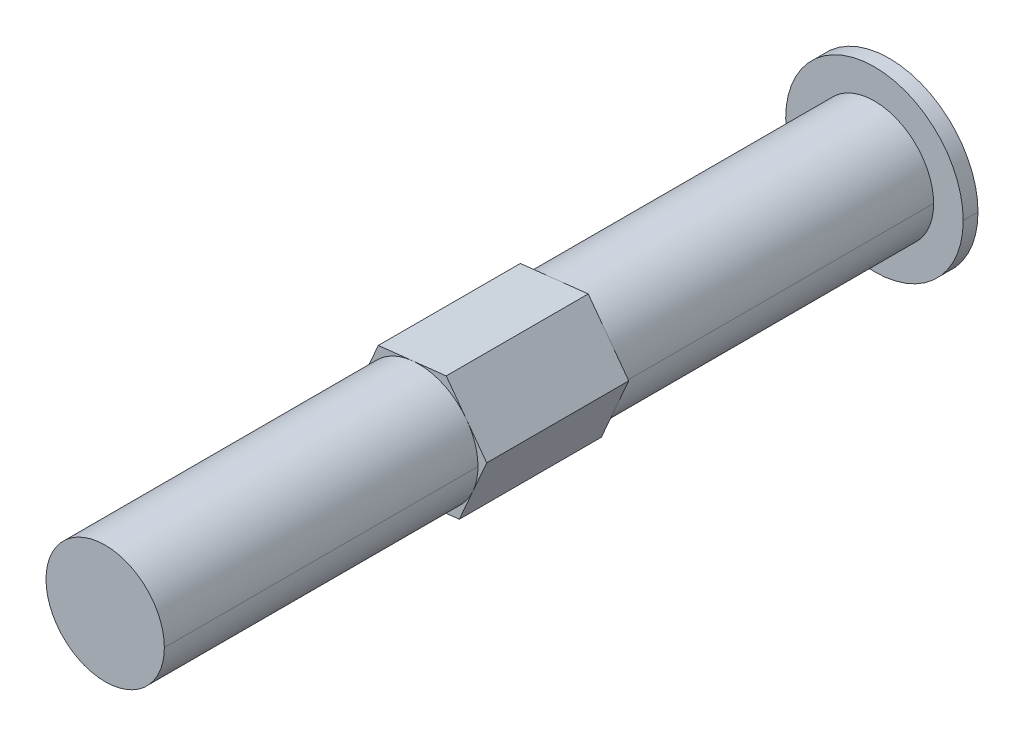
ISO-10303-21;
HEADER;
FILE_DESCRIPTION(('STEP AP214'),'2;1');
FILE_NAME('part.step','',(''),(''),'','','');
FILE_SCHEMA(('AUTOMOTIVE_DESIGN { 1 0 10303 214 1 1 1 1 }'));
ENDSEC;
DATA;
#1=APPLICATION_CONTEXT('core data for automotive mechanical design processes');
#2=APPLICATION_PROTOCOL_DEFINITION('international standard','automotive_design',2000,#1);
#3=PRODUCT_CONTEXT('',#1,'mechanical');
#4=PRODUCT('Part','Part','',(#3));
#5=PRODUCT_RELATED_PRODUCT_CATEGORY('part','',(#4));
#6=PRODUCT_DEFINITION_FORMATION('','',#4);
#7=PRODUCT_DEFINITION_CONTEXT('part definition',#1,'design');
#8=PRODUCT_DEFINITION('design','',#6,#7);
#9=PRODUCT_DEFINITION_SHAPE('','',#8);
#10=(LENGTH_UNIT() NAMED_UNIT(*) SI_UNIT(.MILLI.,.METRE.));
#11=(NAMED_UNIT(*) PLANE_ANGLE_UNIT() SI_UNIT($,.RADIAN.));
#12=(NAMED_UNIT(*) SI_UNIT($,.STERADIAN.) SOLID_ANGLE_UNIT());
#13=UNCERTAINTY_MEASURE_WITH_UNIT(LENGTH_MEASURE(1.E-05),#10,'distance_accuracy_value','');
#14=(GEOMETRIC_REPRESENTATION_CONTEXT(3) GLOBAL_UNCERTAINTY_ASSIGNED_CONTEXT((#13)) GLOBAL_UNIT_ASSIGNED_CONTEXT((#10,
#11,#12)) REPRESENTATION_CONTEXT('',''));
#15=CARTESIAN_POINT('',(0.,0.,0.));
#16=DIRECTION('',(0.,0.,1.));
#17=DIRECTION('',(1.,0.,0.));
#18=AXIS2_PLACEMENT_3D('',#15,#16,#17);
#19=CARTESIAN_POINT('',(0.,0.,-10.31875));
#20=DIRECTION('',(0.,0.,-1.));
#21=DIRECTION('',(0.,-1.,0.));
#22=AXIS2_PLACEMENT_3D('',#19,#20,#21);
#23=PLANE('',#22);
#24=CARTESIAN_POINT('',(0.,0.,-10.31875));
#25=DIRECTION('',(0.,0.,1.));
#26=DIRECTION('',(-1.,0.,0.));
#27=AXIS2_PLACEMENT_3D('',#24,#25,#26);
#28=CIRCLE('',#27,1.5875);
#29=CARTESIAN_POINT('',(1.5875,0.,-10.31875));
#30=VERTEX_POINT('',#29);
#31=CARTESIAN_POINT('',(-1.5875,0.,-10.31875));
#32=VERTEX_POINT('',#31);
#33=EDGE_CURVE('E172',#30,#32,#28,.T.);
#34=ORIENTED_EDGE('',*,*,#33,.F.);
#35=CARTESIAN_POINT('',(0.,0.,-10.31875));
#36=DIRECTION('',(0.,0.,1.));
#37=DIRECTION('',(-1.,0.,0.));
#38=AXIS2_PLACEMENT_3D('',#35,#36,#37);
#39=CIRCLE('',#38,1.5875);
#40=EDGE_CURVE('E165',#32,#30,#39,.T.);
#41=ORIENTED_EDGE('',*,*,#40,.F.);
#42=EDGE_LOOP('',(#34,#41));
#43=FACE_BOUND('',#42,.T.);
#44=CARTESIAN_POINT('',(0.,0.,-10.31875));
#45=DIRECTION('',(0.,0.,-1.));
#46=DIRECTION('',(-1.,0.,0.));
#47=AXIS2_PLACEMENT_3D('',#44,#45,#46);
#48=CIRCLE('',#47,2.38125);
#49=CARTESIAN_POINT('',(2.38125,0.,-10.31875));
#50=VERTEX_POINT('',#49);
#51=CARTESIAN_POINT('',(-2.38125,0.,-10.31875));
#52=VERTEX_POINT('',#51);
#53=EDGE_CURVE('E11',#50,#52,#48,.T.);
#54=ORIENTED_EDGE('',*,*,#53,.F.);
#55=CARTESIAN_POINT('',(0.,0.,-10.31875));
#56=DIRECTION('',(0.,0.,-1.));
#57=DIRECTION('',(-1.,0.,0.));
#58=AXIS2_PLACEMENT_3D('',#55,#56,#57);
#59=CIRCLE('',#58,2.38125);
#60=EDGE_CURVE('E170',#52,#50,#59,.T.);
#61=ORIENTED_EDGE('',*,*,#60,.F.);
#62=EDGE_LOOP('',(#54,#61));
#63=FACE_BOUND('',#62,.T.);
#64=ADVANCED_FACE('F16',(#43,#63),#23,.F.);
#65=CARTESIAN_POINT('',(0.,0.,-10.715625));
#66=DIRECTION('',(0.,0.,-1.));
#67=DIRECTION('',(0.,-1.,0.));
#68=AXIS2_PLACEMENT_3D('',#65,#66,#67);
#69=PLANE('',#68);
#70=CARTESIAN_POINT('',(0.,0.,-10.715625));
#71=DIRECTION('',(0.,0.,-1.));
#72=DIRECTION('',(-1.,0.,0.));
#73=AXIS2_PLACEMENT_3D('',#70,#71,#72);
#74=CIRCLE('',#73,2.38125);
#75=CARTESIAN_POINT('',(2.38125,0.,-10.715625));
#76=VERTEX_POINT('',#75);
#77=CARTESIAN_POINT('',(-2.38125,0.,-10.715625));
#78=VERTEX_POINT('',#77);
#79=EDGE_CURVE('E27',#76,#78,#74,.T.);
#80=ORIENTED_EDGE('',*,*,#79,.T.);
#81=CARTESIAN_POINT('',(0.,0.,-10.715625));
#82=DIRECTION('',(0.,0.,-1.));
#83=DIRECTION('',(-1.,0.,0.));
#84=AXIS2_PLACEMENT_3D('',#81,#82,#83);
#85=CIRCLE('',#84,2.38125);
#86=EDGE_CURVE('E168',#78,#76,#85,.T.);
#87=ORIENTED_EDGE('',*,*,#86,.T.);
#88=EDGE_LOOP('',(#80,#87));
#89=FACE_BOUND('',#88,.T.);
#90=ADVANCED_FACE('F174',(#89),#69,.T.);
#91=CARTESIAN_POINT('',(0.,0.,-10.715625));
#92=DIRECTION('',(0.,0.,1.));
#93=DIRECTION('',(1.,0.,0.));
#94=AXIS2_PLACEMENT_3D('',#91,#92,#93);
#95=CYLINDRICAL_SURFACE('',#94,2.38125);
#96=DIRECTION('',(0.,0.,1.));
#97=VECTOR('',#96,1.);
#98=CARTESIAN_POINT('',(-2.38125,0.,-10.715625));
#99=LINE('',#98,#97);
#100=EDGE_CURVE('E160',#78,#52,#99,.T.);
#101=ORIENTED_EDGE('',*,*,#100,.F.);
#102=ORIENTED_EDGE('',*,*,#79,.F.);
#103=DIRECTION('',(0.,0.,1.));
#104=VECTOR('',#103,1.);
#105=CARTESIAN_POINT('',(2.38125,0.,-10.715625));
#106=LINE('',#105,#104);
#107=EDGE_CURVE('E157',#76,#50,#106,.T.);
#108=ORIENTED_EDGE('',*,*,#107,.T.);
#109=ORIENTED_EDGE('',*,*,#53,.T.);
#110=EDGE_LOOP('',(#101,#102,#108,#109));
#111=FACE_BOUND('',#110,.T.);
#112=ADVANCED_FACE('F156',(#111),#95,.T.);
#113=CARTESIAN_POINT('',(0.,0.,-10.31875));
#114=DIRECTION('',(0.,0.,1.));
#115=DIRECTION('',(1.,0.,0.));
#116=AXIS2_PLACEMENT_3D('',#113,#114,#115);
#117=CYLINDRICAL_SURFACE('',#116,1.5875);
#118=DIRECTION('',(0.,0.,1.));
#119=VECTOR('',#118,1.);
#120=CARTESIAN_POINT('',(-1.5875,0.,-10.31875));
#121=LINE('',#120,#119);
#122=CARTESIAN_POINT('',(-1.5875,0.,-1.905));
#123=VERTEX_POINT('',#122);
#124=EDGE_CURVE('E211',#32,#123,#121,.T.);
#125=ORIENTED_EDGE('',*,*,#124,.F.);
#126=ORIENTED_EDGE('',*,*,#40,.T.);
#127=DIRECTION('',(0.,0.,1.));
#128=VECTOR('',#127,1.);
#129=CARTESIAN_POINT('',(1.5875,0.,-10.31875));
#130=LINE('',#129,#128);
#131=CARTESIAN_POINT('',(1.5875,0.,-1.905));
#132=VERTEX_POINT('',#131);
#133=EDGE_CURVE('E195',#30,#132,#130,.T.);
#134=ORIENTED_EDGE('',*,*,#133,.T.);
#135=CARTESIAN_POINT('',(0.,0.,-1.905));
#136=DIRECTION('',(0.,0.,-1.));
#137=DIRECTION('',(1.,0.,0.));
#138=AXIS2_PLACEMENT_3D('',#135,#136,#137);
#139=CIRCLE('',#138,1.5875);
#140=CARTESIAN_POINT('',(1.45421930245627,-0.636712235129486,-1.905));
#141=VERTEX_POINT('',#140);
#142=EDGE_CURVE('E42',#132,#141,#139,.T.);
#143=ORIENTED_EDGE('',*,*,#142,.T.);
#144=CARTESIAN_POINT('',(0.,0.,-1.905));
#145=DIRECTION('',(0.,0.,-1.));
#146=DIRECTION('',(1.,0.,0.));
#147=AXIS2_PLACEMENT_3D('',#144,#145,#146);
#148=CIRCLE('',#147,1.5875);
#149=CARTESIAN_POINT('',(0.175700680705631,-1.57774697616557,-1.905));
#150=VERTEX_POINT('',#149);
#151=EDGE_CURVE('E314',#141,#150,#148,.T.);
#152=ORIENTED_EDGE('',*,*,#151,.T.);
#153=CARTESIAN_POINT('',(0.,0.,-1.905));
#154=DIRECTION('',(0.,0.,-1.));
#155=DIRECTION('',(1.,0.,0.));
#156=AXIS2_PLACEMENT_3D('',#153,#154,#155);
#157=CIRCLE('',#156,1.5875);
#158=CARTESIAN_POINT('',(-1.27851862175064,-0.941034741036078,-1.905));
#159=VERTEX_POINT('',#158);
#160=EDGE_CURVE('E309',#150,#159,#157,.T.);
#161=ORIENTED_EDGE('',*,*,#160,.T.);
#162=CARTESIAN_POINT('',(0.,0.,-1.905));
#163=DIRECTION('',(0.,0.,-1.));
#164=DIRECTION('',(1.,0.,0.));
#165=AXIS2_PLACEMENT_3D('',#162,#163,#164);
#166=CIRCLE('',#165,1.5875);
#167=EDGE_CURVE('E313',#159,#123,#166,.T.);
#168=ORIENTED_EDGE('',*,*,#167,.T.);
#169=EDGE_LOOP('',(#125,#126,#134,#143,#152,#161,#168));
#170=FACE_BOUND('',#169,.T.);
#171=ADVANCED_FACE('F454',(#170),#117,.T.);
#172=CARTESIAN_POINT('',(0.,0.,-1.905));
#173=DIRECTION('',(0.,0.,1.));
#174=DIRECTION('',(1.,0.,0.));
#175=AXIS2_PLACEMENT_3D('',#172,#173,#174);
#176=PLANE('',#175);
#177=CARTESIAN_POINT('',(0.,0.,-1.905));
#178=DIRECTION('',(0.,0.,-1.));
#179=DIRECTION('',(1.,0.,0.));
#180=AXIS2_PLACEMENT_3D('',#177,#178,#179);
#181=CIRCLE('',#180,1.5875);
#182=CARTESIAN_POINT('',(1.27851862175064,0.941034741036077,-1.905));
#183=VERTEX_POINT('',#182);
#184=EDGE_CURVE('E191',#183,#132,#181,.T.);
#185=ORIENTED_EDGE('',*,*,#184,.F.);
#186=DIRECTION('',(-0.592777789629025,0.805366060945287,0.));
#187=VECTOR('',#186,1.);
#188=CARTESIAN_POINT('',(1.82182528280461,0.202881670604394,-1.905));
#189=LINE('',#188,#187);
#190=CARTESIAN_POINT('',(1.82182528280461,0.202881670604394,-1.905));
#191=VERTEX_POINT('',#190);
#192=EDGE_CURVE('E269',#191,#183,#189,.T.);
#193=ORIENTED_EDGE('',*,*,#192,.F.);
#194=DIRECTION('',(0.401078573309912,0.916043655090567,0.));
#195=VECTOR('',#194,1.);
#196=CARTESIAN_POINT('',(1.08661332210794,-1.47630614086337,-1.905));
#197=LINE('',#196,#195);
#198=EDGE_CURVE('E305',#141,#191,#197,.T.);
#199=ORIENTED_EDGE('',*,*,#198,.F.);
#200=ORIENTED_EDGE('',*,*,#142,.F.);
#201=EDGE_LOOP('',(#185,#193,#199,#200));
#202=FACE_BOUND('',#201,.T.);
#203=ADVANCED_FACE('F448',(#202),#176,.F.);
#204=CARTESIAN_POINT('',(0.,0.,1.905));
#205=DIRECTION('',(0.,0.,1.));
#206=DIRECTION('',(1.,0.,0.));
#207=AXIS2_PLACEMENT_3D('',#204,#205,#206);
#208=PLANE('',#207);
#209=DIRECTION('',(-0.592777789629025,0.805366060945287,0.));
#210=VECTOR('',#209,1.);
#211=CARTESIAN_POINT('',(1.82182528280461,0.202881670604394,1.905));
#212=LINE('',#211,#210);
#213=CARTESIAN_POINT('',(1.82182528280461,0.202881670604394,1.905));
#214=VERTEX_POINT('',#213);
#215=CARTESIAN_POINT('',(1.27851862175064,0.941034741036077,1.905));
#216=VERTEX_POINT('',#215);
#217=EDGE_CURVE('E284',#214,#216,#212,.T.);
#218=ORIENTED_EDGE('',*,*,#217,.T.);
#219=CARTESIAN_POINT('',(0.,0.,1.905));
#220=DIRECTION('',(0.,0.,-1.));
#221=DIRECTION('',(1.,0.,0.));
#222=AXIS2_PLACEMENT_3D('',#219,#220,#221);
#223=CIRCLE('',#222,1.5875);
#224=CARTESIAN_POINT('',(1.5875,0.,1.905));
#225=VERTEX_POINT('',#224);
#226=EDGE_CURVE('E250',#216,#225,#223,.T.);
#227=ORIENTED_EDGE('',*,*,#226,.T.);
#228=CARTESIAN_POINT('',(0.,0.,1.905));
#229=DIRECTION('',(0.,0.,-1.));
#230=DIRECTION('',(1.,0.,0.));
#231=AXIS2_PLACEMENT_3D('',#228,#229,#230);
#232=CIRCLE('',#231,1.5875);
#233=CARTESIAN_POINT('',(1.45421930245627,-0.636712235129486,1.905));
#234=VERTEX_POINT('',#233);
#235=EDGE_CURVE('E201',#225,#234,#232,.T.);
#236=ORIENTED_EDGE('',*,*,#235,.T.);
#237=DIRECTION('',(0.401078573309912,0.916043655090567,0.));
#238=VECTOR('',#237,1.);
#239=CARTESIAN_POINT('',(1.08661332210794,-1.47630614086337,1.905));
#240=LINE('',#239,#238);
#241=EDGE_CURVE('E280',#234,#214,#240,.T.);
#242=ORIENTED_EDGE('',*,*,#241,.T.);
#243=EDGE_LOOP('',(#218,#227,#236,#242));
#244=FACE_BOUND('',#243,.T.);
#245=ADVANCED_FACE('F435',(#244),#208,.T.);
#246=CARTESIAN_POINT('',(0.,0.,-1.905));
#247=DIRECTION('',(0.,0.,1.));
#248=DIRECTION('',(1.,0.,0.));
#249=AXIS2_PLACEMENT_3D('',#246,#247,#248);
#250=PLANE('',#249);
#251=CARTESIAN_POINT('',(0.,0.,-1.905));
#252=DIRECTION('',(0.,0.,-1.));
#253=DIRECTION('',(1.,0.,0.));
#254=AXIS2_PLACEMENT_3D('',#251,#252,#253);
#255=CIRCLE('',#254,1.5875);
#256=CARTESIAN_POINT('',(-0.175700680705631,1.57774697616557,-1.905));
#257=VERTEX_POINT('',#256);
#258=EDGE_CURVE('E196',#257,#183,#255,.T.);
#259=ORIENTED_EDGE('',*,*,#258,.F.);
#260=DIRECTION('',(-0.993856362938937,-0.11067759414528,0.));
#261=VECTOR('',#260,1.);
#262=CARTESIAN_POINT('',(0.735211960696675,1.67918781146776,-1.905));
#263=LINE('',#262,#261);
#264=CARTESIAN_POINT('',(0.735211960696675,1.67918781146776,-1.905));
#265=VERTEX_POINT('',#264);
#266=EDGE_CURVE('E216',#265,#257,#263,.T.);
#267=ORIENTED_EDGE('',*,*,#266,.F.);
#268=DIRECTION('',(-0.592777789629025,0.805366060945287,0.));
#269=VECTOR('',#268,1.);
#270=CARTESIAN_POINT('',(1.82182528280461,0.202881670604394,-1.905));
#271=LINE('',#270,#269);
#272=EDGE_CURVE('E265',#183,#265,#271,.T.);
#273=ORIENTED_EDGE('',*,*,#272,.F.);
#274=EDGE_LOOP('',(#259,#267,#273));
#275=FACE_BOUND('',#274,.T.);
#276=ADVANCED_FACE('F443',(#275),#250,.F.);
#277=CARTESIAN_POINT('',(0.,0.,-1.905));
#278=DIRECTION('',(0.,0.,1.));
#279=DIRECTION('',(1.,0.,0.));
#280=AXIS2_PLACEMENT_3D('',#277,#278,#279);
#281=PLANE('',#280);
#282=CARTESIAN_POINT('',(0.,0.,-1.905));
#283=DIRECTION('',(0.,0.,-1.));
#284=DIRECTION('',(1.,0.,0.));
#285=AXIS2_PLACEMENT_3D('',#282,#283,#284);
#286=CIRCLE('',#285,1.5875);
#287=CARTESIAN_POINT('',(-1.45421930245627,0.636712235129486,-1.905));
#288=VERTEX_POINT('',#287);
#289=EDGE_CURVE('E249',#288,#257,#286,.T.);
#290=ORIENTED_EDGE('',*,*,#289,.F.);
#291=DIRECTION('',(-0.401078573309912,-0.916043655090567,0.));
#292=VECTOR('',#291,1.);
#293=CARTESIAN_POINT('',(-1.08661332210794,1.47630614086337,-1.905));
#294=LINE('',#293,#292);
#295=CARTESIAN_POINT('',(-1.08661332210794,1.47630614086337,-1.905));
#296=VERTEX_POINT('',#295);
#297=EDGE_CURVE('E232',#296,#288,#294,.T.);
#298=ORIENTED_EDGE('',*,*,#297,.F.);
#299=DIRECTION('',(-0.993856362938937,-0.11067759414528,0.));
#300=VECTOR('',#299,1.);
#301=CARTESIAN_POINT('',(0.735211960696675,1.67918781146776,-1.905));
#302=LINE('',#301,#300);
#303=EDGE_CURVE('E212',#257,#296,#302,.T.);
#304=ORIENTED_EDGE('',*,*,#303,.F.);
#305=EDGE_LOOP('',(#290,#298,#304));
#306=FACE_BOUND('',#305,.T.);
#307=ADVANCED_FACE('F18',(#306),#281,.F.);
#308=CARTESIAN_POINT('',(0.,0.,-1.905));
#309=DIRECTION('',(0.,0.,1.));
#310=DIRECTION('',(1.,0.,0.));
#311=AXIS2_PLACEMENT_3D('',#308,#309,#310);
#312=PLANE('',#311);
#313=ORIENTED_EDGE('',*,*,#167,.F.);
#314=DIRECTION('',(0.592777789629025,-0.805366060945287,0.));
#315=VECTOR('',#314,1.);
#316=CARTESIAN_POINT('',(-1.82182528280461,-0.202881670604394,-1.905));
#317=LINE('',#316,#315);
#318=CARTESIAN_POINT('',(-1.82182528280461,-0.202881670604394,-1.905));
#319=VERTEX_POINT('',#318);
#320=EDGE_CURVE('E223',#319,#159,#317,.T.);
#321=ORIENTED_EDGE('',*,*,#320,.F.);
#322=DIRECTION('',(-0.401078573309912,-0.916043655090567,0.));
#323=VECTOR('',#322,1.);
#324=CARTESIAN_POINT('',(-1.08661332210794,1.47630614086337,-1.905));
#325=LINE('',#324,#323);
#326=EDGE_CURVE('E295',#288,#319,#325,.T.);
#327=ORIENTED_EDGE('',*,*,#326,.F.);
#328=CARTESIAN_POINT('',(0.,0.,-1.905));
#329=DIRECTION('',(0.,0.,-1.));
#330=DIRECTION('',(1.,0.,0.));
#331=AXIS2_PLACEMENT_3D('',#328,#329,#330);
#332=CIRCLE('',#331,1.5875);
#333=EDGE_CURVE('E245',#123,#288,#332,.T.);
#334=ORIENTED_EDGE('',*,*,#333,.F.);
#335=EDGE_LOOP('',(#313,#321,#327,#334));
#336=FACE_BOUND('',#335,.T.);
#337=ADVANCED_FACE('F456',(#336),#312,.F.);
#338=CARTESIAN_POINT('',(0.,0.,-1.905));
#339=DIRECTION('',(0.,0.,1.));
#340=DIRECTION('',(1.,0.,0.));
#341=AXIS2_PLACEMENT_3D('',#338,#339,#340);
#342=PLANE('',#341);
#343=ORIENTED_EDGE('',*,*,#160,.F.);
#344=DIRECTION('',(0.993856362938937,0.11067759414528,0.));
#345=VECTOR('',#344,1.);
#346=CARTESIAN_POINT('',(-0.735211960696674,-1.67918781146776,-1.905));
#347=LINE('',#346,#345);
#348=CARTESIAN_POINT('',(-0.735211960696674,-1.67918781146776,-1.905));
#349=VERTEX_POINT('',#348);
#350=EDGE_CURVE('E189',#349,#150,#347,.T.);
#351=ORIENTED_EDGE('',*,*,#350,.F.);
#352=DIRECTION('',(0.592777789629025,-0.805366060945287,0.));
#353=VECTOR('',#352,1.);
#354=CARTESIAN_POINT('',(-1.82182528280461,-0.202881670604394,-1.905));
#355=LINE('',#354,#353);
#356=EDGE_CURVE('E218',#159,#349,#355,.T.);
#357=ORIENTED_EDGE('',*,*,#356,.F.);
#358=EDGE_LOOP('',(#343,#351,#357));
#359=FACE_BOUND('',#358,.T.);
#360=ADVANCED_FACE('F458',(#359),#342,.F.);
#361=CARTESIAN_POINT('',(0.,0.,-1.905));
#362=DIRECTION('',(0.,0.,1.));
#363=DIRECTION('',(1.,0.,0.));
#364=AXIS2_PLACEMENT_3D('',#361,#362,#363);
#365=PLANE('',#364);
#366=ORIENTED_EDGE('',*,*,#151,.F.);
#367=DIRECTION('',(0.401078573309912,0.916043655090567,0.));
#368=VECTOR('',#367,1.);
#369=CARTESIAN_POINT('',(1.08661332210794,-1.47630614086337,-1.905));
#370=LINE('',#369,#368);
#371=CARTESIAN_POINT('',(1.08661332210794,-1.47630614086337,-1.905));
#372=VERTEX_POINT('',#371);
#373=EDGE_CURVE('E279',#372,#141,#370,.T.);
#374=ORIENTED_EDGE('',*,*,#373,.F.);
#375=DIRECTION('',(0.993856362938937,0.11067759414528,0.));
#376=VECTOR('',#375,1.);
#377=CARTESIAN_POINT('',(-0.735211960696674,-1.67918781146776,-1.905));
#378=LINE('',#377,#376);
#379=EDGE_CURVE('E254',#150,#372,#378,.T.);
#380=ORIENTED_EDGE('',*,*,#379,.F.);
#381=EDGE_LOOP('',(#366,#374,#380));
#382=FACE_BOUND('',#381,.T.);
#383=ADVANCED_FACE('F465',(#382),#365,.F.);
#384=CARTESIAN_POINT('',(0.,0.,1.905));
#385=DIRECTION('',(0.,0.,1.));
#386=DIRECTION('',(1.,0.,0.));
#387=AXIS2_PLACEMENT_3D('',#384,#385,#386);
#388=PLANE('',#387);
#389=DIRECTION('',(-0.993856362938937,-0.11067759414528,0.));
#390=VECTOR('',#389,1.);
#391=CARTESIAN_POINT('',(0.735211960696675,1.67918781146776,1.905));
#392=LINE('',#391,#390);
#393=CARTESIAN_POINT('',(0.735211960696675,1.67918781146776,1.905));
#394=VERTEX_POINT('',#393);
#395=CARTESIAN_POINT('',(-0.175700680705631,1.57774697616557,1.905));
#396=VERTEX_POINT('',#395);
#397=EDGE_CURVE('E263',#394,#396,#392,.T.);
#398=ORIENTED_EDGE('',*,*,#397,.T.);
#399=CARTESIAN_POINT('',(0.,0.,1.905));
#400=DIRECTION('',(0.,0.,-1.));
#401=DIRECTION('',(1.,0.,0.));
#402=AXIS2_PLACEMENT_3D('',#399,#400,#401);
#403=CIRCLE('',#402,1.5875);
#404=EDGE_CURVE('E244',#396,#216,#403,.T.);
#405=ORIENTED_EDGE('',*,*,#404,.T.);
#406=DIRECTION('',(-0.592777789629025,0.805366060945287,0.));
#407=VECTOR('',#406,1.);
#408=CARTESIAN_POINT('',(1.82182528280461,0.202881670604394,1.905));
#409=LINE('',#408,#407);
#410=EDGE_CURVE('E200',#216,#394,#409,.T.);
#411=ORIENTED_EDGE('',*,*,#410,.T.);
#412=EDGE_LOOP('',(#398,#405,#411));
#413=FACE_BOUND('',#412,.T.);
#414=ADVANCED_FACE('F417',(#413),#388,.T.);
#415=CARTESIAN_POINT('',(0.,0.,1.905));
#416=DIRECTION('',(0.,0.,1.));
#417=DIRECTION('',(1.,0.,0.));
#418=AXIS2_PLACEMENT_3D('',#415,#416,#417);
#419=PLANE('',#418);
#420=DIRECTION('',(-0.401078573309912,-0.916043655090567,0.));
#421=VECTOR('',#420,1.);
#422=CARTESIAN_POINT('',(-1.08661332210794,1.47630614086337,1.905));
#423=LINE('',#422,#421);
#424=CARTESIAN_POINT('',(-1.08661332210794,1.47630614086337,1.905));
#425=VERTEX_POINT('',#424);
#426=CARTESIAN_POINT('',(-1.45421930245627,0.636712235129486,1.905));
#427=VERTEX_POINT('',#426);
#428=EDGE_CURVE('E228',#425,#427,#423,.T.);
#429=ORIENTED_EDGE('',*,*,#428,.T.);
#430=CARTESIAN_POINT('',(0.,0.,1.905));
#431=DIRECTION('',(0.,0.,-1.));
#432=DIRECTION('',(1.,0.,0.));
#433=AXIS2_PLACEMENT_3D('',#430,#431,#432);
#434=CIRCLE('',#433,1.5875);
#435=EDGE_CURVE('E239',#427,#396,#434,.T.);
#436=ORIENTED_EDGE('',*,*,#435,.T.);
#437=DIRECTION('',(-0.993856362938937,-0.11067759414528,0.));
#438=VECTOR('',#437,1.);
#439=CARTESIAN_POINT('',(0.735211960696675,1.67918781146776,1.905));
#440=LINE('',#439,#438);
#441=EDGE_CURVE('E259',#396,#425,#440,.T.);
#442=ORIENTED_EDGE('',*,*,#441,.T.);
#443=EDGE_LOOP('',(#429,#436,#442));
#444=FACE_BOUND('',#443,.T.);
#445=ADVANCED_FACE('F427',(#444),#419,.T.);
#446=CARTESIAN_POINT('',(0.,0.,1.905));
#447=DIRECTION('',(0.,0.,1.));
#448=DIRECTION('',(1.,0.,0.));
#449=AXIS2_PLACEMENT_3D('',#446,#447,#448);
#450=PLANE('',#449);
#451=DIRECTION('',(0.592777789629025,-0.805366060945287,0.));
#452=VECTOR('',#451,1.);
#453=CARTESIAN_POINT('',(-1.82182528280461,-0.202881670604394,1.905));
#454=LINE('',#453,#452);
#455=CARTESIAN_POINT('',(-1.82182528280461,-0.202881670604394,1.905));
#456=VERTEX_POINT('',#455);
#457=CARTESIAN_POINT('',(-1.27851862175064,-0.941034741036078,1.905));
#458=VERTEX_POINT('',#457);
#459=EDGE_CURVE('E227',#456,#458,#454,.T.);
#460=ORIENTED_EDGE('',*,*,#459,.T.);
#461=CARTESIAN_POINT('',(0.,0.,1.905));
#462=DIRECTION('',(0.,0.,-1.));
#463=DIRECTION('',(1.,0.,0.));
#464=AXIS2_PLACEMENT_3D('',#461,#462,#463);
#465=CIRCLE('',#464,1.5875);
#466=CARTESIAN_POINT('',(-1.5875,0.,1.905));
#467=VERTEX_POINT('',#466);
#468=EDGE_CURVE('E243',#458,#467,#465,.T.);
#469=ORIENTED_EDGE('',*,*,#468,.T.);
#470=CARTESIAN_POINT('',(0.,0.,1.905));
#471=DIRECTION('',(0.,0.,-1.));
#472=DIRECTION('',(1.,0.,0.));
#473=AXIS2_PLACEMENT_3D('',#470,#471,#472);
#474=CIRCLE('',#473,1.5875);
#475=EDGE_CURVE('E203',#467,#427,#474,.T.);
#476=ORIENTED_EDGE('',*,*,#475,.T.);
#477=DIRECTION('',(-0.401078573309912,-0.916043655090567,0.));
#478=VECTOR('',#477,1.);
#479=CARTESIAN_POINT('',(-1.08661332210794,1.47630614086337,1.905));
#480=LINE('',#479,#478);
#481=EDGE_CURVE('E233',#427,#456,#480,.T.);
#482=ORIENTED_EDGE('',*,*,#481,.T.);
#483=EDGE_LOOP('',(#460,#469,#476,#482));
#484=FACE_BOUND('',#483,.T.);
#485=ADVANCED_FACE('F499',(#484),#450,.T.);
#486=CARTESIAN_POINT('',(0.,0.,1.905));
#487=DIRECTION('',(0.,0.,1.));
#488=DIRECTION('',(1.,0.,0.));
#489=AXIS2_PLACEMENT_3D('',#486,#487,#488);
#490=PLANE('',#489);
#491=DIRECTION('',(0.993856362938937,0.11067759414528,0.));
#492=VECTOR('',#491,1.);
#493=CARTESIAN_POINT('',(-0.735211960696674,-1.67918781146776,1.905));
#494=LINE('',#493,#492);
#495=CARTESIAN_POINT('',(-0.735211960696674,-1.67918781146776,1.905));
#496=VERTEX_POINT('',#495);
#497=CARTESIAN_POINT('',(0.175700680705631,-1.57774697616557,1.905));
#498=VERTEX_POINT('',#497);
#499=EDGE_CURVE('E185',#496,#498,#494,.T.);
#500=ORIENTED_EDGE('',*,*,#499,.T.);
#501=CARTESIAN_POINT('',(0.,0.,1.905));
#502=DIRECTION('',(0.,0.,-1.));
#503=DIRECTION('',(1.,0.,0.));
#504=AXIS2_PLACEMENT_3D('',#501,#502,#503);
#505=CIRCLE('',#504,1.5875);
#506=EDGE_CURVE('E332',#498,#458,#505,.T.);
#507=ORIENTED_EDGE('',*,*,#506,.T.);
#508=DIRECTION('',(0.592777789629025,-0.805366060945287,0.));
#509=VECTOR('',#508,1.);
#510=CARTESIAN_POINT('',(-1.82182528280461,-0.202881670604394,1.905));
#511=LINE('',#510,#509);
#512=EDGE_CURVE('E20',#458,#496,#511,.T.);
#513=ORIENTED_EDGE('',*,*,#512,.T.);
#514=EDGE_LOOP('',(#500,#507,#513));
#515=FACE_BOUND('',#514,.T.);
#516=ADVANCED_FACE('F482',(#515),#490,.T.);
#517=CARTESIAN_POINT('',(0.,0.,1.905));
#518=DIRECTION('',(0.,0.,1.));
#519=DIRECTION('',(1.,0.,0.));
#520=AXIS2_PLACEMENT_3D('',#517,#518,#519);
#521=PLANE('',#520);
#522=DIRECTION('',(0.401078573309912,0.916043655090567,0.));
#523=VECTOR('',#522,1.);
#524=CARTESIAN_POINT('',(1.08661332210794,-1.47630614086337,1.905));
#525=LINE('',#524,#523);
#526=CARTESIAN_POINT('',(1.08661332210794,-1.47630614086337,1.905));
#527=VERTEX_POINT('',#526);
#528=EDGE_CURVE('E276',#527,#234,#525,.T.);
#529=ORIENTED_EDGE('',*,*,#528,.T.);
#530=CARTESIAN_POINT('',(0.,0.,1.905));
#531=DIRECTION('',(0.,0.,-1.));
#532=DIRECTION('',(1.,0.,0.));
#533=AXIS2_PLACEMENT_3D('',#530,#531,#532);
#534=CIRCLE('',#533,1.5875);
#535=EDGE_CURVE('E184',#234,#498,#534,.T.);
#536=ORIENTED_EDGE('',*,*,#535,.T.);
#537=DIRECTION('',(0.993856362938937,0.11067759414528,0.));
#538=VECTOR('',#537,1.);
#539=CARTESIAN_POINT('',(-0.735211960696674,-1.67918781146776,1.905));
#540=LINE('',#539,#538);
#541=EDGE_CURVE('E190',#498,#527,#540,.T.);
#542=ORIENTED_EDGE('',*,*,#541,.T.);
#543=EDGE_LOOP('',(#529,#536,#542));
#544=FACE_BOUND('',#543,.T.);
#545=ADVANCED_FACE('F478',(#544),#521,.T.);
#546=CARTESIAN_POINT('',(1.08661332210794,-1.47630614086337,1.905));
#547=DIRECTION('',(-0.916043655090567,0.401078573309912,0.));
#548=DIRECTION('',(0.,0.,1.));
#549=AXIS2_PLACEMENT_3D('',#546,#547,#548);
#550=PLANE('',#549);
#551=ORIENTED_EDGE('',*,*,#241,.F.);
#552=ORIENTED_EDGE('',*,*,#528,.F.);
#553=DIRECTION('',(0.,0.,-1.));
#554=VECTOR('',#553,1.);
#555=CARTESIAN_POINT('',(1.08661332210794,-1.47630614086337,1.905));
#556=LINE('',#555,#554);
#557=EDGE_CURVE('E258',#527,#372,#556,.T.);
#558=ORIENTED_EDGE('',*,*,#557,.T.);
#559=ORIENTED_EDGE('',*,*,#373,.T.);
#560=ORIENTED_EDGE('',*,*,#198,.T.);
#561=DIRECTION('',(0.,0.,-1.));
#562=VECTOR('',#561,1.);
#563=CARTESIAN_POINT('',(1.82182528280461,0.202881670604394,1.905));
#564=LINE('',#563,#562);
#565=EDGE_CURVE('E323',#214,#191,#564,.T.);
#566=ORIENTED_EDGE('',*,*,#565,.F.);
#567=EDGE_LOOP('',(#551,#552,#558,#559,#560,#566));
#568=FACE_BOUND('',#567,.T.);
#569=ADVANCED_FACE('F481',(#568),#550,.F.);
#570=CARTESIAN_POINT('',(-0.735211960696674,-1.67918781146776,1.905));
#571=DIRECTION('',(-0.11067759414528,0.993856362938937,0.));
#572=DIRECTION('',(0.,0.,1.));
#573=AXIS2_PLACEMENT_3D('',#570,#571,#572);
#574=PLANE('',#573);
#575=ORIENTED_EDGE('',*,*,#541,.F.);
#576=ORIENTED_EDGE('',*,*,#499,.F.);
#577=DIRECTION('',(0.,0.,-1.));
#578=VECTOR('',#577,1.);
#579=CARTESIAN_POINT('',(-0.735211960696674,-1.67918781146776,1.905));
#580=LINE('',#579,#578);
#581=EDGE_CURVE('E222',#496,#349,#580,.T.);
#582=ORIENTED_EDGE('',*,*,#581,.T.);
#583=ORIENTED_EDGE('',*,*,#350,.T.);
#584=ORIENTED_EDGE('',*,*,#379,.T.);
#585=ORIENTED_EDGE('',*,*,#557,.F.);
#586=EDGE_LOOP('',(#575,#576,#582,#583,#584,#585));
#587=FACE_BOUND('',#586,.T.);
#588=ADVANCED_FACE('F486',(#587),#574,.F.);
#589=CARTESIAN_POINT('',(-1.82182528280461,-0.202881670604394,1.905));
#590=DIRECTION('',(0.805366060945287,0.592777789629025,0.));
#591=DIRECTION('',(0.,0.,-1.));
#592=AXIS2_PLACEMENT_3D('',#589,#590,#591);
#593=PLANE('',#592);
#594=ORIENTED_EDGE('',*,*,#512,.F.);
#595=ORIENTED_EDGE('',*,*,#459,.F.);
#596=DIRECTION('',(0.,0.,-1.));
#597=VECTOR('',#596,1.);
#598=CARTESIAN_POINT('',(-1.82182528280461,-0.202881670604394,1.905));
#599=LINE('',#598,#597);
#600=EDGE_CURVE('E291',#456,#319,#599,.T.);
#601=ORIENTED_EDGE('',*,*,#600,.T.);
#602=ORIENTED_EDGE('',*,*,#320,.T.);
#603=ORIENTED_EDGE('',*,*,#356,.T.);
#604=ORIENTED_EDGE('',*,*,#581,.F.);
#605=EDGE_LOOP('',(#594,#595,#601,#602,#603,#604));
#606=FACE_BOUND('',#605,.T.);
#607=ADVANCED_FACE('F489',(#606),#593,.F.);
#608=CARTESIAN_POINT('',(-1.08661332210794,1.47630614086337,1.905));
#609=DIRECTION('',(0.916043655090567,-0.401078573309912,0.));
#610=DIRECTION('',(0.,0.,-1.));
#611=AXIS2_PLACEMENT_3D('',#608,#609,#610);
#612=PLANE('',#611);
#613=ORIENTED_EDGE('',*,*,#481,.F.);
#614=ORIENTED_EDGE('',*,*,#428,.F.);
#615=DIRECTION('',(0.,0.,-1.));
#616=VECTOR('',#615,1.);
#617=CARTESIAN_POINT('',(-1.08661332210794,1.47630614086337,1.905));
#618=LINE('',#617,#616);
#619=EDGE_CURVE('E215',#425,#296,#618,.T.);
#620=ORIENTED_EDGE('',*,*,#619,.T.);
#621=ORIENTED_EDGE('',*,*,#297,.T.);
#622=ORIENTED_EDGE('',*,*,#326,.T.);
#623=ORIENTED_EDGE('',*,*,#600,.F.);
#624=EDGE_LOOP('',(#613,#614,#620,#621,#622,#623));
#625=FACE_BOUND('',#624,.T.);
#626=ADVANCED_FACE('F496',(#625),#612,.F.);
#627=CARTESIAN_POINT('',(0.735211960696675,1.67918781146776,1.905));
#628=DIRECTION('',(0.11067759414528,-0.993856362938937,0.));
#629=DIRECTION('',(0.,0.,-1.));
#630=AXIS2_PLACEMENT_3D('',#627,#628,#629);
#631=PLANE('',#630);
#632=ORIENTED_EDGE('',*,*,#441,.F.);
#633=ORIENTED_EDGE('',*,*,#397,.F.);
#634=DIRECTION('',(0.,0.,-1.));
#635=VECTOR('',#634,1.);
#636=CARTESIAN_POINT('',(0.735211960696675,1.67918781146776,1.905));
#637=LINE('',#636,#635);
#638=EDGE_CURVE('E264',#394,#265,#637,.T.);
#639=ORIENTED_EDGE('',*,*,#638,.T.);
#640=ORIENTED_EDGE('',*,*,#266,.T.);
#641=ORIENTED_EDGE('',*,*,#303,.T.);
#642=ORIENTED_EDGE('',*,*,#619,.F.);
#643=EDGE_LOOP('',(#632,#633,#639,#640,#641,#642));
#644=FACE_BOUND('',#643,.T.);
#645=ADVANCED_FACE('F424',(#644),#631,.F.);
#646=CARTESIAN_POINT('',(1.82182528280461,0.202881670604394,1.905));
#647=DIRECTION('',(-0.805366060945287,-0.592777789629025,0.));
#648=DIRECTION('',(-0.592777789629025,0.805366060945287,0.));
#649=AXIS2_PLACEMENT_3D('',#646,#647,#648);
#650=PLANE('',#649);
#651=ORIENTED_EDGE('',*,*,#410,.F.);
#652=ORIENTED_EDGE('',*,*,#217,.F.);
#653=ORIENTED_EDGE('',*,*,#565,.T.);
#654=ORIENTED_EDGE('',*,*,#192,.T.);
#655=ORIENTED_EDGE('',*,*,#272,.T.);
#656=ORIENTED_EDGE('',*,*,#638,.F.);
#657=EDGE_LOOP('',(#651,#652,#653,#654,#655,#656));
#658=FACE_BOUND('',#657,.T.);
#659=ADVANCED_FACE('F441',(#658),#650,.F.);
#660=CARTESIAN_POINT('',(0.,0.,10.31875));
#661=DIRECTION('',(0.,0.,1.));
#662=DIRECTION('',(1.,0.,0.));
#663=AXIS2_PLACEMENT_3D('',#660,#661,#662);
#664=PLANE('',#663);
#665=CARTESIAN_POINT('',(0.,0.,10.31875));
#666=DIRECTION('',(0.,0.,1.));
#667=DIRECTION('',(1.,0.,0.));
#668=AXIS2_PLACEMENT_3D('',#665,#666,#667);
#669=CIRCLE('',#668,1.5875);
#670=CARTESIAN_POINT('',(1.5875,0.,10.31875));
#671=VERTEX_POINT('',#670);
#672=CARTESIAN_POINT('',(-1.5875,0.,10.31875));
#673=VERTEX_POINT('',#672);
#674=EDGE_CURVE('E234',#671,#673,#669,.T.);
#675=ORIENTED_EDGE('',*,*,#674,.T.);
#676=CARTESIAN_POINT('',(0.,0.,10.31875));
#677=DIRECTION('',(0.,0.,1.));
#678=DIRECTION('',(1.,0.,0.));
#679=AXIS2_PLACEMENT_3D('',#676,#677,#678);
#680=CIRCLE('',#679,1.5875);
#681=EDGE_CURVE('E197',#673,#671,#680,.T.);
#682=ORIENTED_EDGE('',*,*,#681,.T.);
#683=EDGE_LOOP('',(#675,#682));
#684=FACE_BOUND('',#683,.T.);
#685=ADVANCED_FACE('F502',(#684),#664,.T.);
#686=CARTESIAN_POINT('',(0.,0.,-10.31875));
#687=DIRECTION('',(0.,0.,1.));
#688=DIRECTION('',(1.,0.,0.));
#689=AXIS2_PLACEMENT_3D('',#686,#687,#688);
#690=CYLINDRICAL_SURFACE('',#689,1.5875);
#691=DIRECTION('',(0.,0.,1.));
#692=VECTOR('',#691,1.);
#693=CARTESIAN_POINT('',(-1.5875,0.,-10.31875));
#694=LINE('',#693,#692);
#695=EDGE_CURVE('E207',#467,#673,#694,.T.);
#696=ORIENTED_EDGE('',*,*,#695,.F.);
#697=ORIENTED_EDGE('',*,*,#468,.F.);
#698=ORIENTED_EDGE('',*,*,#506,.F.);
#699=ORIENTED_EDGE('',*,*,#535,.F.);
#700=ORIENTED_EDGE('',*,*,#235,.F.);
#701=DIRECTION('',(0.,0.,1.));
#702=VECTOR('',#701,1.);
#703=CARTESIAN_POINT('',(1.5875,0.,-10.31875));
#704=LINE('',#703,#702);
#705=EDGE_CURVE('E238',#225,#671,#704,.T.);
#706=ORIENTED_EDGE('',*,*,#705,.T.);
#707=ORIENTED_EDGE('',*,*,#681,.F.);
#708=EDGE_LOOP('',(#696,#697,#698,#699,#700,#706,#707));
#709=FACE_BOUND('',#708,.T.);
#710=ADVANCED_FACE('F504',(#709),#690,.T.);
#711=CARTESIAN_POINT('',(0.,0.,-10.31875));
#712=DIRECTION('',(0.,0.,1.));
#713=DIRECTION('',(1.,0.,0.));
#714=AXIS2_PLACEMENT_3D('',#711,#712,#713);
#715=CYLINDRICAL_SURFACE('',#714,1.5875);
#716=ORIENTED_EDGE('',*,*,#475,.F.);
#717=ORIENTED_EDGE('',*,*,#695,.T.);
#718=ORIENTED_EDGE('',*,*,#674,.F.);
#719=ORIENTED_EDGE('',*,*,#705,.F.);
#720=ORIENTED_EDGE('',*,*,#226,.F.);
#721=ORIENTED_EDGE('',*,*,#404,.F.);
#722=ORIENTED_EDGE('',*,*,#435,.F.);
#723=EDGE_LOOP('',(#716,#717,#718,#719,#720,#721,#722));
#724=FACE_BOUND('',#723,.T.);
#725=ADVANCED_FACE('F431',(#724),#715,.T.);
#726=CARTESIAN_POINT('',(0.,0.,-10.31875));
#727=DIRECTION('',(0.,0.,1.));
#728=DIRECTION('',(1.,0.,0.));
#729=AXIS2_PLACEMENT_3D('',#726,#727,#728);
#730=CYLINDRICAL_SURFACE('',#729,1.5875);
#731=ORIENTED_EDGE('',*,*,#33,.T.);
#732=ORIENTED_EDGE('',*,*,#124,.T.);
#733=ORIENTED_EDGE('',*,*,#333,.T.);
#734=ORIENTED_EDGE('',*,*,#289,.T.);
#735=ORIENTED_EDGE('',*,*,#258,.T.);
#736=ORIENTED_EDGE('',*,*,#184,.T.);
#737=ORIENTED_EDGE('',*,*,#133,.F.);
#738=EDGE_LOOP('',(#731,#732,#733,#734,#735,#736,#737));
#739=FACE_BOUND('',#738,.T.);
#740=ADVANCED_FACE('F385',(#739),#730,.T.);
#741=CARTESIAN_POINT('',(0.,0.,-10.715625));
#742=DIRECTION('',(0.,0.,1.));
#743=DIRECTION('',(1.,0.,0.));
#744=AXIS2_PLACEMENT_3D('',#741,#742,#743);
#745=CYLINDRICAL_SURFACE('',#744,2.38125);
#746=ORIENTED_EDGE('',*,*,#86,.F.);
#747=ORIENTED_EDGE('',*,*,#100,.T.);
#748=ORIENTED_EDGE('',*,*,#60,.T.);
#749=ORIENTED_EDGE('',*,*,#107,.F.);
#750=EDGE_LOOP('',(#746,#747,#748,#749));
#751=FACE_BOUND('',#750,.T.);
#752=ADVANCED_FACE('F167',(#751),#745,.T.);
#753=CLOSED_SHELL('',(#64,#90,#112,#171,#203,#245,#276,#307,#337,#360,#383,#414,#445,#485,#516,
#545,#569,#588,#607,#626,#645,#659,#685,#710,#725,#740,#752));
#754=MANIFOLD_SOLID_BREP('B1',#753);
#755=ADVANCED_BREP_SHAPE_REPRESENTATION('',(#18,#754),#14);
#756=SHAPE_DEFINITION_REPRESENTATION(#9,#755);
ENDSEC;
END-ISO-10303-21;
